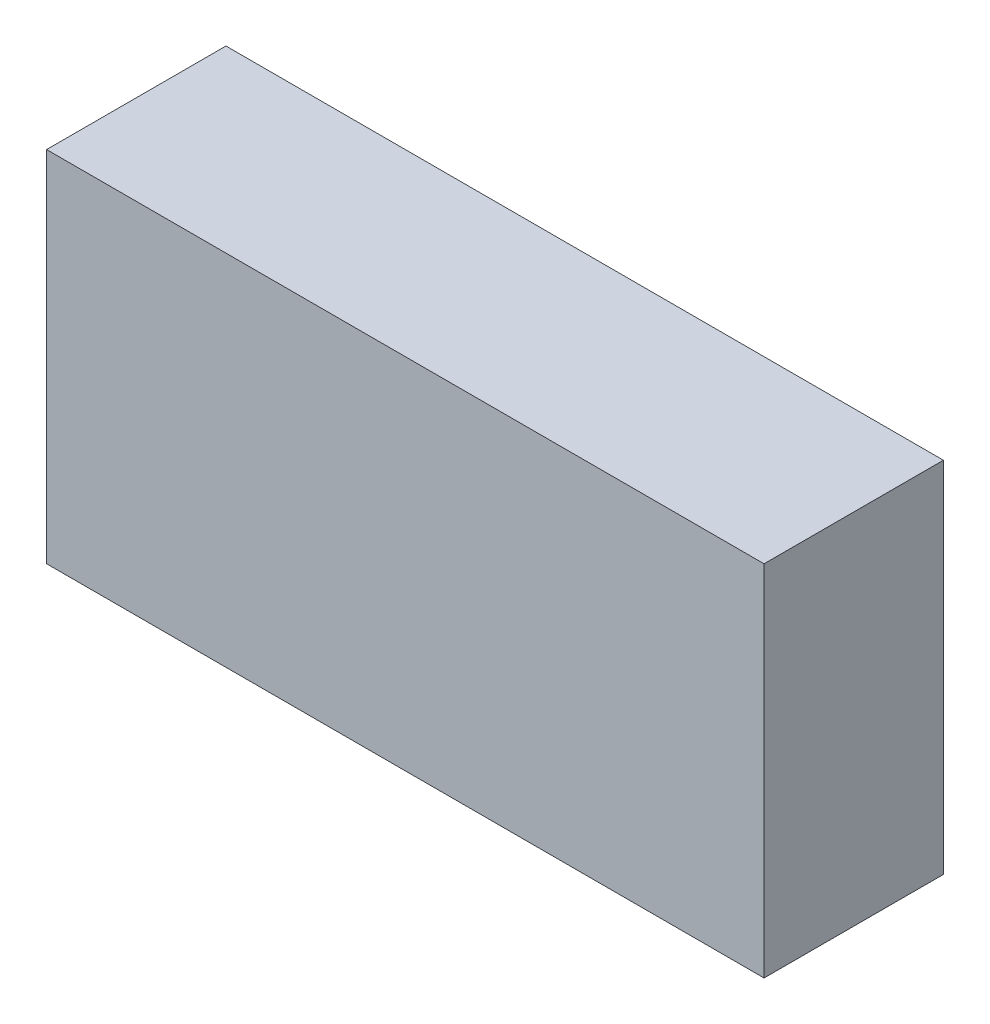
ISO-10303-21;
HEADER;
FILE_DESCRIPTION(('STEP AP214'),'2;1');
FILE_NAME('part.step','',(''),(''),'','','');
FILE_SCHEMA(('AUTOMOTIVE_DESIGN { 1 0 10303 214 1 1 1 1 }'));
ENDSEC;
DATA;
#1=APPLICATION_CONTEXT('core data for automotive mechanical design processes');
#2=APPLICATION_PROTOCOL_DEFINITION('international standard','automotive_design',2000,#1);
#3=PRODUCT_CONTEXT('',#1,'mechanical');
#4=PRODUCT('Part','Part','',(#3));
#5=PRODUCT_RELATED_PRODUCT_CATEGORY('part','',(#4));
#6=PRODUCT_DEFINITION_FORMATION('','',#4);
#7=PRODUCT_DEFINITION_CONTEXT('part definition',#1,'design');
#8=PRODUCT_DEFINITION('design','',#6,#7);
#9=PRODUCT_DEFINITION_SHAPE('','',#8);
#10=(LENGTH_UNIT() NAMED_UNIT(*) SI_UNIT(.MILLI.,.METRE.));
#11=(NAMED_UNIT(*) PLANE_ANGLE_UNIT() SI_UNIT($,.RADIAN.));
#12=(NAMED_UNIT(*) SI_UNIT($,.STERADIAN.) SOLID_ANGLE_UNIT());
#13=UNCERTAINTY_MEASURE_WITH_UNIT(LENGTH_MEASURE(1.E-05),#10,'distance_accuracy_value','');
#14=(GEOMETRIC_REPRESENTATION_CONTEXT(3) GLOBAL_UNCERTAINTY_ASSIGNED_CONTEXT((#13)) GLOBAL_UNIT_ASSIGNED_CONTEXT((#10,
#11,#12)) REPRESENTATION_CONTEXT('',''));
#15=CARTESIAN_POINT('',(0.,0.,0.));
#16=DIRECTION('',(0.,0.,1.));
#17=DIRECTION('',(1.,0.,0.));
#18=AXIS2_PLACEMENT_3D('',#15,#16,#17);
#19=CARTESIAN_POINT('',(-20.,10.,10.));
#20=DIRECTION('',(1.,0.,0.));
#21=DIRECTION('',(0.,0.,-1.));
#22=AXIS2_PLACEMENT_3D('',#19,#20,#21);
#23=PLANE('',#22);
#24=DIRECTION('',(0.,-1.,0.));
#25=VECTOR('',#24,1.);
#26=CARTESIAN_POINT('',(-20.,10.,0.));
#27=LINE('',#26,#25);
#28=CARTESIAN_POINT('',(-20.,10.,0.));
#29=VERTEX_POINT('',#28);
#30=CARTESIAN_POINT('',(-20.,-10.,0.));
#31=VERTEX_POINT('',#30);
#32=EDGE_CURVE('E105',#29,#31,#27,.T.);
#33=ORIENTED_EDGE('',*,*,#32,.T.);
#34=DIRECTION('',(0.,0.,-1.));
#35=VECTOR('',#34,1.);
#36=CARTESIAN_POINT('',(-20.,-10.,10.));
#37=LINE('',#36,#35);
#38=CARTESIAN_POINT('',(-20.,-10.,10.));
#39=VERTEX_POINT('',#38);
#40=EDGE_CURVE('E11',#39,#31,#37,.T.);
#41=ORIENTED_EDGE('',*,*,#40,.F.);
#42=DIRECTION('',(0.,-1.,0.));
#43=VECTOR('',#42,1.);
#44=CARTESIAN_POINT('',(-20.,10.,10.));
#45=LINE('',#44,#43);
#46=CARTESIAN_POINT('',(-20.,10.,10.));
#47=VERTEX_POINT('',#46);
#48=EDGE_CURVE('E89',#47,#39,#45,.T.);
#49=ORIENTED_EDGE('',*,*,#48,.F.);
#50=DIRECTION('',(0.,0.,-1.));
#51=VECTOR('',#50,1.);
#52=CARTESIAN_POINT('',(-20.,10.,10.));
#53=LINE('',#52,#51);
#54=EDGE_CURVE('E98',#47,#29,#53,.T.);
#55=ORIENTED_EDGE('',*,*,#54,.T.);
#56=EDGE_LOOP('',(#33,#41,#49,#55));
#57=FACE_BOUND('',#56,.T.);
#58=ADVANCED_FACE('F39',(#57),#23,.F.);
#59=CARTESIAN_POINT('',(-20.,-10.,10.));
#60=DIRECTION('',(0.,1.,0.));
#61=DIRECTION('',(0.,0.,1.));
#62=AXIS2_PLACEMENT_3D('',#59,#60,#61);
#63=PLANE('',#62);
#64=DIRECTION('',(1.,0.,0.));
#65=VECTOR('',#64,1.);
#66=CARTESIAN_POINT('',(-20.,-10.,0.));
#67=LINE('',#66,#65);
#68=CARTESIAN_POINT('',(20.,-10.,0.));
#69=VERTEX_POINT('',#68);
#70=EDGE_CURVE('E94',#31,#69,#67,.T.);
#71=ORIENTED_EDGE('',*,*,#70,.T.);
#72=DIRECTION('',(0.,0.,-1.));
#73=VECTOR('',#72,1.);
#74=CARTESIAN_POINT('',(20.,-10.,10.));
#75=LINE('',#74,#73);
#76=CARTESIAN_POINT('',(20.,-10.,10.));
#77=VERTEX_POINT('',#76);
#78=EDGE_CURVE('E50',#77,#69,#75,.T.);
#79=ORIENTED_EDGE('',*,*,#78,.F.);
#80=DIRECTION('',(1.,0.,0.));
#81=VECTOR('',#80,1.);
#82=CARTESIAN_POINT('',(-20.,-10.,10.));
#83=LINE('',#82,#81);
#84=EDGE_CURVE('E84',#39,#77,#83,.T.);
#85=ORIENTED_EDGE('',*,*,#84,.F.);
#86=ORIENTED_EDGE('',*,*,#40,.T.);
#87=EDGE_LOOP('',(#71,#79,#85,#86));
#88=FACE_BOUND('',#87,.T.);
#89=ADVANCED_FACE('F91',(#88),#63,.F.);
#90=CARTESIAN_POINT('',(20.,-10.,10.));
#91=DIRECTION('',(-1.,0.,0.));
#92=DIRECTION('',(0.,0.,1.));
#93=AXIS2_PLACEMENT_3D('',#90,#91,#92);
#94=PLANE('',#93);
#95=DIRECTION('',(0.,1.,0.));
#96=VECTOR('',#95,1.);
#97=CARTESIAN_POINT('',(20.,-10.,0.));
#98=LINE('',#97,#96);
#99=CARTESIAN_POINT('',(20.,10.,0.));
#100=VERTEX_POINT('',#99);
#101=EDGE_CURVE('E75',#69,#100,#98,.T.);
#102=ORIENTED_EDGE('',*,*,#101,.T.);
#103=DIRECTION('',(0.,0.,-1.));
#104=VECTOR('',#103,1.);
#105=CARTESIAN_POINT('',(20.,10.,10.));
#106=LINE('',#105,#104);
#107=CARTESIAN_POINT('',(20.,10.,10.));
#108=VERTEX_POINT('',#107);
#109=EDGE_CURVE('E92',#108,#100,#106,.T.);
#110=ORIENTED_EDGE('',*,*,#109,.F.);
#111=DIRECTION('',(0.,1.,0.));
#112=VECTOR('',#111,1.);
#113=CARTESIAN_POINT('',(20.,-10.,10.));
#114=LINE('',#113,#112);
#115=EDGE_CURVE('E86',#77,#108,#114,.T.);
#116=ORIENTED_EDGE('',*,*,#115,.F.);
#117=ORIENTED_EDGE('',*,*,#78,.T.);
#118=EDGE_LOOP('',(#102,#110,#116,#117));
#119=FACE_BOUND('',#118,.T.);
#120=ADVANCED_FACE('F96',(#119),#94,.F.);
#121=CARTESIAN_POINT('',(20.,10.,10.));
#122=DIRECTION('',(0.,-1.,0.));
#123=DIRECTION('',(0.,0.,-1.));
#124=AXIS2_PLACEMENT_3D('',#121,#122,#123);
#125=PLANE('',#124);
#126=DIRECTION('',(-1.,0.,0.));
#127=VECTOR('',#126,1.);
#128=CARTESIAN_POINT('',(20.,10.,0.));
#129=LINE('',#128,#127);
#130=EDGE_CURVE('E79',#100,#29,#129,.T.);
#131=ORIENTED_EDGE('',*,*,#130,.T.);
#132=ORIENTED_EDGE('',*,*,#54,.F.);
#133=DIRECTION('',(-1.,0.,0.));
#134=VECTOR('',#133,1.);
#135=CARTESIAN_POINT('',(20.,10.,10.));
#136=LINE('',#135,#134);
#137=EDGE_CURVE('E54',#108,#47,#136,.T.);
#138=ORIENTED_EDGE('',*,*,#137,.F.);
#139=ORIENTED_EDGE('',*,*,#109,.T.);
#140=EDGE_LOOP('',(#131,#132,#138,#139));
#141=FACE_BOUND('',#140,.T.);
#142=ADVANCED_FACE('F108',(#141),#125,.F.);
#143=CARTESIAN_POINT('',(0.,0.,10.));
#144=DIRECTION('',(0.,0.,1.));
#145=DIRECTION('',(1.,0.,0.));
#146=AXIS2_PLACEMENT_3D('',#143,#144,#145);
#147=PLANE('',#146);
#148=ORIENTED_EDGE('',*,*,#48,.T.);
#149=ORIENTED_EDGE('',*,*,#84,.T.);
#150=ORIENTED_EDGE('',*,*,#115,.T.);
#151=ORIENTED_EDGE('',*,*,#137,.T.);
#152=EDGE_LOOP('',(#148,#149,#150,#151));
#153=FACE_BOUND('',#152,.T.);
#154=ADVANCED_FACE('F88',(#153),#147,.T.);
#155=CARTESIAN_POINT('',(0.,0.,0.));
#156=DIRECTION('',(0.,0.,1.));
#157=DIRECTION('',(1.,0.,0.));
#158=AXIS2_PLACEMENT_3D('',#155,#156,#157);
#159=PLANE('',#158);
#160=ORIENTED_EDGE('',*,*,#32,.F.);
#161=ORIENTED_EDGE('',*,*,#130,.F.);
#162=ORIENTED_EDGE('',*,*,#101,.F.);
#163=ORIENTED_EDGE('',*,*,#70,.F.);
#164=EDGE_LOOP('',(#160,#161,#162,#163));
#165=FACE_BOUND('',#164,.T.);
#166=ADVANCED_FACE('F115',(#165),#159,.F.);
#167=CLOSED_SHELL('',(#58,#89,#120,#142,#154,#166));
#168=MANIFOLD_SOLID_BREP('B2',#167);
#169=ADVANCED_BREP_SHAPE_REPRESENTATION('',(#18,#168),#14);
#170=SHAPE_DEFINITION_REPRESENTATION(#9,#169);
ENDSEC;
END-ISO-10303-21;
